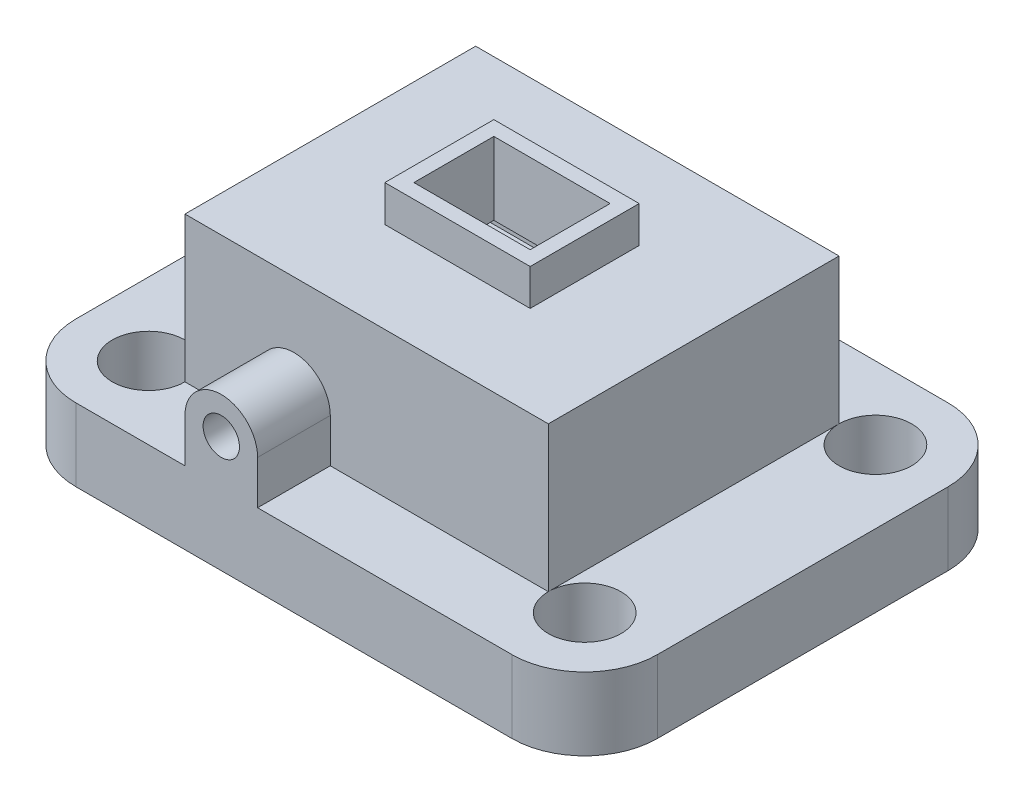
ISO-10303-21;
HEADER;
FILE_DESCRIPTION(('STEP AP214'),'2;1');
FILE_NAME('part.step','',(''),(''),'','','');
FILE_SCHEMA(('AUTOMOTIVE_DESIGN { 1 0 10303 214 1 1 1 1 }'));
ENDSEC;
DATA;
#1=APPLICATION_CONTEXT('core data for automotive mechanical design processes');
#2=APPLICATION_PROTOCOL_DEFINITION('international standard','automotive_design',2000,#1);
#3=PRODUCT_CONTEXT('',#1,'mechanical');
#4=PRODUCT('Part','Part','',(#3));
#5=PRODUCT_RELATED_PRODUCT_CATEGORY('part','',(#4));
#6=PRODUCT_DEFINITION_FORMATION('','',#4);
#7=PRODUCT_DEFINITION_CONTEXT('part definition',#1,'design');
#8=PRODUCT_DEFINITION('design','',#6,#7);
#9=PRODUCT_DEFINITION_SHAPE('','',#8);
#10=(LENGTH_UNIT() NAMED_UNIT(*) SI_UNIT(.MILLI.,.METRE.));
#11=(NAMED_UNIT(*) PLANE_ANGLE_UNIT() SI_UNIT($,.RADIAN.));
#12=(NAMED_UNIT(*) SI_UNIT($,.STERADIAN.) SOLID_ANGLE_UNIT());
#13=UNCERTAINTY_MEASURE_WITH_UNIT(LENGTH_MEASURE(1.E-05),#10,'distance_accuracy_value','');
#14=(GEOMETRIC_REPRESENTATION_CONTEXT(3) GLOBAL_UNCERTAINTY_ASSIGNED_CONTEXT((#13)) GLOBAL_UNIT_ASSIGNED_CONTEXT((#10,
#11,#12)) REPRESENTATION_CONTEXT('',''));
#15=CARTESIAN_POINT('',(0.,0.,0.));
#16=DIRECTION('',(0.,0.,1.));
#17=DIRECTION('',(1.,0.,0.));
#18=AXIS2_PLACEMENT_3D('',#15,#16,#17);
#19=CARTESIAN_POINT('',(0.,25.,45.));
#20=DIRECTION('',(0.,0.,-1.));
#21=DIRECTION('',(-1.,0.,0.));
#22=AXIS2_PLACEMENT_3D('',#19,#20,#21);
#23=PLANE('',#22);
#24=DIRECTION('',(1.,0.,0.));
#25=VECTOR('',#24,1.);
#26=CARTESIAN_POINT('',(0.,15.,45.));
#27=LINE('',#26,#25);
#28=CARTESIAN_POINT('',(32.2912878474779,15.,45.));
#29=VERTEX_POINT('',#28);
#30=CARTESIAN_POINT('',(60.,15.,45.));
#31=VERTEX_POINT('',#30);
#32=EDGE_CURVE('E483',#29,#31,#27,.T.);
#33=ORIENTED_EDGE('',*,*,#32,.F.);
#34=CARTESIAN_POINT('',(30.,16.,45.));
#35=DIRECTION('',(0.,0.,-1.));
#36=DIRECTION('',(-1.,0.,0.));
#37=AXIS2_PLACEMENT_3D('',#34,#35,#36);
#38=CIRCLE('',#37,2.50000000000001);
#39=CARTESIAN_POINT('',(27.7087121525221,15.,45.));
#40=VERTEX_POINT('',#39);
#41=EDGE_CURVE('E537',#29,#40,#38,.F.);
#42=ORIENTED_EDGE('',*,*,#41,.T.);
#43=CARTESIAN_POINT('',(20.,15.,45.));
#44=VERTEX_POINT('',#43);
#45=EDGE_CURVE('E479',#44,#40,#27,.T.);
#46=ORIENTED_EDGE('',*,*,#45,.F.);
#47=DIRECTION('',(0.,-1.,0.));
#48=VECTOR('',#47,1.);
#49=CARTESIAN_POINT('',(20.,25.,45.));
#50=LINE('',#49,#48);
#51=CARTESIAN_POINT('',(20.,25.,45.));
#52=VERTEX_POINT('',#51);
#53=EDGE_CURVE('E466',#52,#44,#50,.T.);
#54=ORIENTED_EDGE('',*,*,#53,.F.);
#55=DIRECTION('',(1.,0.,0.));
#56=VECTOR('',#55,1.);
#57=CARTESIAN_POINT('',(0.,25.,45.));
#58=LINE('',#57,#56);
#59=CARTESIAN_POINT('',(60.,25.,45.));
#60=VERTEX_POINT('',#59);
#61=EDGE_CURVE('E472',#52,#60,#58,.T.);
#62=ORIENTED_EDGE('',*,*,#61,.T.);
#63=DIRECTION('',(0.,-1.,0.));
#64=VECTOR('',#63,1.);
#65=CARTESIAN_POINT('',(60.,25.,45.));
#66=LINE('',#65,#64);
#67=EDGE_CURVE('E459',#60,#31,#66,.T.);
#68=ORIENTED_EDGE('',*,*,#67,.T.);
#69=EDGE_LOOP('',(#33,#42,#46,#54,#62,#68));
#70=FACE_BOUND('',#69,.T.);
#71=ADVANCED_FACE('F96',(#70),#23,.T.);
#72=CARTESIAN_POINT('',(60.,25.,0.));
#73=DIRECTION('',(1.,0.,0.));
#74=DIRECTION('',(0.,0.,-1.));
#75=AXIS2_PLACEMENT_3D('',#72,#73,#74);
#76=PLANE('',#75);
#77=DIRECTION('',(0.,0.,1.));
#78=VECTOR('',#77,1.);
#79=CARTESIAN_POINT('',(60.,15.,0.));
#80=LINE('',#79,#78);
#81=CARTESIAN_POINT('',(60.,15.,15.));
#82=VERTEX_POINT('',#81);
#83=EDGE_CURVE('E476',#82,#31,#80,.T.);
#84=ORIENTED_EDGE('',*,*,#83,.T.);
#85=ORIENTED_EDGE('',*,*,#67,.F.);
#86=DIRECTION('',(0.,0.,1.));
#87=VECTOR('',#86,1.);
#88=CARTESIAN_POINT('',(60.,25.,0.));
#89=LINE('',#88,#87);
#90=CARTESIAN_POINT('',(60.,25.,15.));
#91=VERTEX_POINT('',#90);
#92=EDGE_CURVE('E489',#91,#60,#89,.T.);
#93=ORIENTED_EDGE('',*,*,#92,.F.);
#94=DIRECTION('',(0.,-1.,0.));
#95=VECTOR('',#94,1.);
#96=CARTESIAN_POINT('',(60.,25.,15.));
#97=LINE('',#96,#95);
#98=EDGE_CURVE('E462',#91,#82,#97,.T.);
#99=ORIENTED_EDGE('',*,*,#98,.T.);
#100=EDGE_LOOP('',(#84,#85,#93,#99));
#101=FACE_BOUND('',#100,.T.);
#102=ADVANCED_FACE('F557',(#101),#76,.F.);
#103=CARTESIAN_POINT('',(0.,25.,15.));
#104=DIRECTION('',(0.,0.,-1.));
#105=DIRECTION('',(-1.,0.,0.));
#106=AXIS2_PLACEMENT_3D('',#103,#104,#105);
#107=PLANE('',#106);
#108=DIRECTION('',(1.,0.,0.));
#109=VECTOR('',#108,1.);
#110=CARTESIAN_POINT('',(0.,15.,15.));
#111=LINE('',#110,#109);
#112=CARTESIAN_POINT('',(20.,15.,15.));
#113=VERTEX_POINT('',#112);
#114=EDGE_CURVE('E473',#113,#82,#111,.T.);
#115=ORIENTED_EDGE('',*,*,#114,.T.);
#116=ORIENTED_EDGE('',*,*,#98,.F.);
#117=DIRECTION('',(1.,0.,0.));
#118=VECTOR('',#117,1.);
#119=CARTESIAN_POINT('',(0.,25.,15.));
#120=LINE('',#119,#118);
#121=CARTESIAN_POINT('',(20.,25.,15.));
#122=VERTEX_POINT('',#121);
#123=EDGE_CURVE('E486',#122,#91,#120,.T.);
#124=ORIENTED_EDGE('',*,*,#123,.F.);
#125=DIRECTION('',(0.,-1.,0.));
#126=VECTOR('',#125,1.);
#127=CARTESIAN_POINT('',(20.,25.,15.));
#128=LINE('',#127,#126);
#129=EDGE_CURVE('E464',#122,#113,#128,.T.);
#130=ORIENTED_EDGE('',*,*,#129,.T.);
#131=EDGE_LOOP('',(#115,#116,#124,#130));
#132=FACE_BOUND('',#131,.T.);
#133=ADVANCED_FACE('F559',(#132),#107,.F.);
#134=CARTESIAN_POINT('',(20.,25.,0.));
#135=DIRECTION('',(-1.,0.,0.));
#136=DIRECTION('',(0.,0.,1.));
#137=AXIS2_PLACEMENT_3D('',#134,#135,#136);
#138=PLANE('',#137);
#139=DIRECTION('',(0.,0.,-1.));
#140=VECTOR('',#139,1.);
#141=CARTESIAN_POINT('',(20.,15.,0.));
#142=LINE('',#141,#140);
#143=EDGE_CURVE('E469',#44,#113,#142,.T.);
#144=ORIENTED_EDGE('',*,*,#143,.T.);
#145=ORIENTED_EDGE('',*,*,#129,.F.);
#146=DIRECTION('',(0.,0.,-1.));
#147=VECTOR('',#146,1.);
#148=CARTESIAN_POINT('',(20.,25.,0.));
#149=LINE('',#148,#147);
#150=EDGE_CURVE('E468',#52,#122,#149,.T.);
#151=ORIENTED_EDGE('',*,*,#150,.F.);
#152=ORIENTED_EDGE('',*,*,#53,.T.);
#153=EDGE_LOOP('',(#144,#145,#151,#152));
#154=FACE_BOUND('',#153,.T.);
#155=ADVANCED_FACE('F550',(#154),#138,.F.);
#156=CARTESIAN_POINT('',(0.,25.,0.));
#157=DIRECTION('',(0.,-1.,0.));
#158=DIRECTION('',(0.,0.,-1.));
#159=AXIS2_PLACEMENT_3D('',#156,#157,#158);
#160=PLANE('',#159);
#161=DIRECTION('',(0.,0.,1.));
#162=VECTOR('',#161,1.);
#163=CARTESIAN_POINT('',(48.,25.,0.));
#164=LINE('',#163,#162);
#165=CARTESIAN_POINT('',(48.,25.,24.5));
#166=VERTEX_POINT('',#165);
#167=CARTESIAN_POINT('',(48.,25.,35.5));
#168=VERTEX_POINT('',#167);
#169=EDGE_CURVE('E12',#166,#168,#164,.T.);
#170=ORIENTED_EDGE('',*,*,#169,.F.);
#171=DIRECTION('',(1.,0.,0.));
#172=VECTOR('',#171,1.);
#173=CARTESIAN_POINT('',(0.,25.,24.5));
#174=LINE('',#173,#172);
#175=CARTESIAN_POINT('',(32.,25.,24.5));
#176=VERTEX_POINT('',#175);
#177=EDGE_CURVE('E298',#176,#166,#174,.T.);
#178=ORIENTED_EDGE('',*,*,#177,.F.);
#179=DIRECTION('',(0.,0.,-1.));
#180=VECTOR('',#179,1.);
#181=CARTESIAN_POINT('',(32.,25.,0.));
#182=LINE('',#181,#180);
#183=CARTESIAN_POINT('',(32.,25.,35.5));
#184=VERTEX_POINT('',#183);
#185=EDGE_CURVE('E302',#184,#176,#182,.T.);
#186=ORIENTED_EDGE('',*,*,#185,.F.);
#187=DIRECTION('',(-1.,0.,0.));
#188=VECTOR('',#187,1.);
#189=CARTESIAN_POINT('',(0.,25.,35.5));
#190=LINE('',#189,#188);
#191=EDGE_CURVE('E104',#168,#184,#190,.T.);
#192=ORIENTED_EDGE('',*,*,#191,.F.);
#193=EDGE_LOOP('',(#170,#178,#186,#192));
#194=FACE_BOUND('',#193,.T.);
#195=ORIENTED_EDGE('',*,*,#61,.F.);
#196=ORIENTED_EDGE('',*,*,#150,.T.);
#197=ORIENTED_EDGE('',*,*,#123,.T.);
#198=ORIENTED_EDGE('',*,*,#92,.T.);
#199=EDGE_LOOP('',(#195,#196,#197,#198));
#200=FACE_BOUND('',#199,.T.);
#201=ADVANCED_FACE('F305',(#194,#200),#160,.T.);
#202=CARTESIAN_POINT('',(0.,15.,0.));
#203=DIRECTION('',(0.,-1.,0.));
#204=DIRECTION('',(0.,0.,-1.));
#205=AXIS2_PLACEMENT_3D('',#202,#203,#204);
#206=PLANE('',#205);
#207=ORIENTED_EDGE('',*,*,#45,.T.);
#208=EDGE_CURVE('E482',#40,#29,#27,.T.);
#209=ORIENTED_EDGE('',*,*,#208,.T.);
#210=ORIENTED_EDGE('',*,*,#32,.T.);
#211=ORIENTED_EDGE('',*,*,#83,.F.);
#212=ORIENTED_EDGE('',*,*,#114,.F.);
#213=ORIENTED_EDGE('',*,*,#143,.F.);
#214=EDGE_LOOP('',(#207,#209,#210,#211,#212,#213));
#215=FACE_BOUND('',#214,.T.);
#216=ADVANCED_FACE('F546',(#215),#206,.F.);
#217=CARTESIAN_POINT('',(0.,25.,45.));
#218=DIRECTION('',(0.,0.,-1.));
#219=DIRECTION('',(-1.,0.,0.));
#220=AXIS2_PLACEMENT_3D('',#217,#218,#219);
#221=PLANE('',#220);
#222=EDGE_CURVE('E118',#40,#29,#38,.F.);
#223=ORIENTED_EDGE('',*,*,#222,.T.);
#224=ORIENTED_EDGE('',*,*,#208,.F.);
#225=EDGE_LOOP('',(#223,#224));
#226=FACE_BOUND('',#225,.T.);
#227=ADVANCED_FACE('F579',(#226),#221,.F.);
#228=CARTESIAN_POINT('',(0.,30.,0.));
#229=DIRECTION('',(0.,-1.,0.));
#230=DIRECTION('',(0.,0.,-1.));
#231=AXIS2_PLACEMENT_3D('',#228,#229,#230);
#232=PLANE('',#231);
#233=DIRECTION('',(1.,0.,0.));
#234=VECTOR('',#233,1.);
#235=CARTESIAN_POINT('',(0.,30.,50.));
#236=LINE('',#235,#234);
#237=CARTESIAN_POINT('',(15.,30.,50.));
#238=VERTEX_POINT('',#237);
#239=CARTESIAN_POINT('',(65.,30.,50.));
#240=VERTEX_POINT('',#239);
#241=EDGE_CURVE('E440',#238,#240,#236,.T.);
#242=ORIENTED_EDGE('',*,*,#241,.T.);
#243=DIRECTION('',(0.,0.,1.));
#244=VECTOR('',#243,1.);
#245=CARTESIAN_POINT('',(65.,30.,0.));
#246=LINE('',#245,#244);
#247=CARTESIAN_POINT('',(65.,30.,9.99999999999999));
#248=VERTEX_POINT('',#247);
#249=EDGE_CURVE('E455',#248,#240,#246,.T.);
#250=ORIENTED_EDGE('',*,*,#249,.F.);
#251=DIRECTION('',(1.,0.,0.));
#252=VECTOR('',#251,1.);
#253=CARTESIAN_POINT('',(0.,30.,9.99999999999999));
#254=LINE('',#253,#252);
#255=CARTESIAN_POINT('',(15.,30.,9.99999999999999));
#256=VERTEX_POINT('',#255);
#257=EDGE_CURVE('E452',#256,#248,#254,.T.);
#258=ORIENTED_EDGE('',*,*,#257,.F.);
#259=DIRECTION('',(0.,0.,-1.));
#260=VECTOR('',#259,1.);
#261=CARTESIAN_POINT('',(15.,30.,0.));
#262=LINE('',#261,#260);
#263=EDGE_CURVE('E436',#238,#256,#262,.T.);
#264=ORIENTED_EDGE('',*,*,#263,.F.);
#265=EDGE_LOOP('',(#242,#250,#258,#264));
#266=FACE_BOUND('',#265,.T.);
#267=DIRECTION('',(0.,0.,1.));
#268=VECTOR('',#267,1.);
#269=CARTESIAN_POINT('',(30.,30.,22.5));
#270=LINE('',#269,#268);
#271=CARTESIAN_POINT('',(30.,30.,22.5));
#272=VERTEX_POINT('',#271);
#273=CARTESIAN_POINT('',(30.,30.,37.5));
#274=VERTEX_POINT('',#273);
#275=EDGE_CURVE('E516',#272,#274,#270,.T.);
#276=ORIENTED_EDGE('',*,*,#275,.F.);
#277=DIRECTION('',(-1.,0.,0.));
#278=VECTOR('',#277,1.);
#279=CARTESIAN_POINT('',(30.,30.,22.5));
#280=LINE('',#279,#278);
#281=CARTESIAN_POINT('',(50.,30.,22.5));
#282=VERTEX_POINT('',#281);
#283=EDGE_CURVE('E506',#282,#272,#280,.T.);
#284=ORIENTED_EDGE('',*,*,#283,.F.);
#285=DIRECTION('',(0.,0.,-1.));
#286=VECTOR('',#285,1.);
#287=CARTESIAN_POINT('',(50.,30.,22.5));
#288=LINE('',#287,#286);
#289=CARTESIAN_POINT('',(50.,30.,37.5));
#290=VERTEX_POINT('',#289);
#291=EDGE_CURVE('E510',#290,#282,#288,.T.);
#292=ORIENTED_EDGE('',*,*,#291,.F.);
#293=DIRECTION('',(1.,0.,0.));
#294=VECTOR('',#293,1.);
#295=CARTESIAN_POINT('',(40.,30.,37.5));
#296=LINE('',#295,#294);
#297=EDGE_CURVE('E513',#274,#290,#296,.T.);
#298=ORIENTED_EDGE('',*,*,#297,.F.);
#299=EDGE_LOOP('',(#276,#284,#292,#298));
#300=FACE_BOUND('',#299,.T.);
#301=ADVANCED_FACE('F575',(#266,#300),#232,.F.);
#302=CARTESIAN_POINT('',(0.,10.,0.));
#303=DIRECTION('',(0.,1.,0.));
#304=DIRECTION('',(0.,0.,1.));
#305=AXIS2_PLACEMENT_3D('',#302,#303,#304);
#306=PLANE('',#305);
#307=CARTESIAN_POINT('',(70.,10.,50.));
#308=DIRECTION('',(0.,1.,0.));
#309=DIRECTION('',(0.,0.,1.));
#310=AXIS2_PLACEMENT_3D('',#307,#308,#309);
#311=CIRCLE('',#310,5.00000000000001);
#312=CARTESIAN_POINT('',(65.,10.,50.));
#313=VERTEX_POINT('',#312);
#314=EDGE_CURVE('E372',#313,#313,#311,.F.);
#315=ORIENTED_EDGE('',*,*,#314,.T.);
#316=DIRECTION('',(1.,0.,0.));
#317=VECTOR('',#316,1.);
#318=CARTESIAN_POINT('',(0.,10.,50.));
#319=LINE('',#318,#317);
#320=CARTESIAN_POINT('',(35.,10.,50.));
#321=VERTEX_POINT('',#320);
#322=EDGE_CURVE('E449',#321,#313,#319,.T.);
#323=ORIENTED_EDGE('',*,*,#322,.F.);
#324=DIRECTION('',(0.,0.,1.));
#325=VECTOR('',#324,1.);
#326=CARTESIAN_POINT('',(35.,10.,50.));
#327=LINE('',#326,#325);
#328=CARTESIAN_POINT('',(35.,10.,60.));
#329=VERTEX_POINT('',#328);
#330=EDGE_CURVE('E366',#321,#329,#327,.T.);
#331=ORIENTED_EDGE('',*,*,#330,.T.);
#332=DIRECTION('',(1.,0.,0.));
#333=VECTOR('',#332,1.);
#334=CARTESIAN_POINT('',(0.,10.,60.));
#335=LINE('',#334,#333);
#336=CARTESIAN_POINT('',(70.,10.,60.));
#337=VERTEX_POINT('',#336);
#338=EDGE_CURVE('E393',#329,#337,#335,.T.);
#339=ORIENTED_EDGE('',*,*,#338,.T.);
#340=CARTESIAN_POINT('',(70.,10.,50.));
#341=DIRECTION('',(0.,1.,0.));
#342=DIRECTION('',(0.,0.,1.));
#343=AXIS2_PLACEMENT_3D('',#340,#341,#342);
#344=CIRCLE('',#343,10.);
#345=CARTESIAN_POINT('',(80.,10.,50.));
#346=VERTEX_POINT('',#345);
#347=EDGE_CURVE('E388',#337,#346,#344,.T.);
#348=ORIENTED_EDGE('',*,*,#347,.T.);
#349=DIRECTION('',(0.,0.,1.));
#350=VECTOR('',#349,1.);
#351=CARTESIAN_POINT('',(80.,10.,0.));
#352=LINE('',#351,#350);
#353=CARTESIAN_POINT('',(80.,10.,9.99999999999999));
#354=VERTEX_POINT('',#353);
#355=EDGE_CURVE('E385',#354,#346,#352,.T.);
#356=ORIENTED_EDGE('',*,*,#355,.F.);
#357=CARTESIAN_POINT('',(70.,10.,9.99999999999999));
#358=DIRECTION('',(0.,1.,0.));
#359=DIRECTION('',(0.,0.,1.));
#360=AXIS2_PLACEMENT_3D('',#357,#358,#359);
#361=CIRCLE('',#360,10.);
#362=CARTESIAN_POINT('',(70.,10.,0.));
#363=VERTEX_POINT('',#362);
#364=EDGE_CURVE('E383',#354,#363,#361,.T.);
#365=ORIENTED_EDGE('',*,*,#364,.T.);
#366=DIRECTION('',(1.,0.,0.));
#367=VECTOR('',#366,1.);
#368=CARTESIAN_POINT('',(0.,10.,0.));
#369=LINE('',#368,#367);
#370=CARTESIAN_POINT('',(10.,10.,0.));
#371=VERTEX_POINT('',#370);
#372=EDGE_CURVE('E380',#371,#363,#369,.T.);
#373=ORIENTED_EDGE('',*,*,#372,.F.);
#374=CARTESIAN_POINT('',(10.,10.,9.99999999999999));
#375=DIRECTION('',(0.,1.,0.));
#376=DIRECTION('',(0.,0.,1.));
#377=AXIS2_PLACEMENT_3D('',#374,#375,#376);
#378=CIRCLE('',#377,9.99999999999999);
#379=CARTESIAN_POINT('',(0.,10.,9.99999999999999));
#380=VERTEX_POINT('',#379);
#381=EDGE_CURVE('E378',#371,#380,#378,.T.);
#382=ORIENTED_EDGE('',*,*,#381,.T.);
#383=DIRECTION('',(0.,0.,1.));
#384=VECTOR('',#383,1.);
#385=CARTESIAN_POINT('',(0.,10.,0.));
#386=LINE('',#385,#384);
#387=CARTESIAN_POINT('',(0.,10.,50.));
#388=VERTEX_POINT('',#387);
#389=EDGE_CURVE('E335',#380,#388,#386,.T.);
#390=ORIENTED_EDGE('',*,*,#389,.T.);
#391=CARTESIAN_POINT('',(10.,10.,50.));
#392=DIRECTION('',(0.,1.,0.));
#393=DIRECTION('',(0.,0.,1.));
#394=AXIS2_PLACEMENT_3D('',#391,#392,#393);
#395=CIRCLE('',#394,10.);
#396=CARTESIAN_POINT('',(10.,10.,60.));
#397=VERTEX_POINT('',#396);
#398=EDGE_CURVE('E394',#388,#397,#395,.T.);
#399=ORIENTED_EDGE('',*,*,#398,.T.);
#400=CARTESIAN_POINT('',(25.,10.,60.));
#401=VERTEX_POINT('',#400);
#402=EDGE_CURVE('E390',#397,#401,#335,.T.);
#403=ORIENTED_EDGE('',*,*,#402,.T.);
#404=DIRECTION('',(0.,0.,1.));
#405=VECTOR('',#404,1.);
#406=CARTESIAN_POINT('',(25.,10.,50.));
#407=LINE('',#406,#405);
#408=CARTESIAN_POINT('',(25.,10.,50.));
#409=VERTEX_POINT('',#408);
#410=EDGE_CURVE('E403',#409,#401,#407,.T.);
#411=ORIENTED_EDGE('',*,*,#410,.F.);
#412=CARTESIAN_POINT('',(15.,10.,50.));
#413=VERTEX_POINT('',#412);
#414=EDGE_CURVE('E447',#413,#409,#319,.T.);
#415=ORIENTED_EDGE('',*,*,#414,.F.);
#416=CARTESIAN_POINT('',(10.,10.,50.));
#417=DIRECTION('',(0.,1.,0.));
#418=DIRECTION('',(0.,0.,1.));
#419=AXIS2_PLACEMENT_3D('',#416,#417,#418);
#420=CIRCLE('',#419,5.);
#421=EDGE_CURVE('E331',#413,#413,#420,.T.);
#422=ORIENTED_EDGE('',*,*,#421,.F.);
#423=DIRECTION('',(0.,0.,-1.));
#424=VECTOR('',#423,1.);
#425=CARTESIAN_POINT('',(15.,10.,0.));
#426=LINE('',#425,#424);
#427=CARTESIAN_POINT('',(15.,10.,9.99999999999999));
#428=VERTEX_POINT('',#427);
#429=EDGE_CURVE('E437',#413,#428,#426,.T.);
#430=ORIENTED_EDGE('',*,*,#429,.T.);
#431=CARTESIAN_POINT('',(10.,10.,9.99999999999999));
#432=DIRECTION('',(0.,1.,0.));
#433=DIRECTION('',(0.,0.,1.));
#434=AXIS2_PLACEMENT_3D('',#431,#432,#433);
#435=CIRCLE('',#434,5.);
#436=EDGE_CURVE('E369',#428,#428,#435,.T.);
#437=ORIENTED_EDGE('',*,*,#436,.F.);
#438=DIRECTION('',(1.,0.,0.));
#439=VECTOR('',#438,1.);
#440=CARTESIAN_POINT('',(0.,10.,9.99999999999999));
#441=LINE('',#440,#439);
#442=CARTESIAN_POINT('',(65.,10.,9.99999999999999));
#443=VERTEX_POINT('',#442);
#444=EDGE_CURVE('E441',#428,#443,#441,.T.);
#445=ORIENTED_EDGE('',*,*,#444,.T.);
#446=CARTESIAN_POINT('',(70.,10.,9.99999999999999));
#447=DIRECTION('',(0.,1.,0.));
#448=DIRECTION('',(0.,0.,1.));
#449=AXIS2_PLACEMENT_3D('',#446,#447,#448);
#450=CIRCLE('',#449,5.);
#451=EDGE_CURVE('E375',#443,#443,#450,.F.);
#452=ORIENTED_EDGE('',*,*,#451,.T.);
#453=DIRECTION('',(0.,0.,1.));
#454=VECTOR('',#453,1.);
#455=CARTESIAN_POINT('',(65.,10.,0.));
#456=LINE('',#455,#454);
#457=EDGE_CURVE('E444',#443,#313,#456,.T.);
#458=ORIENTED_EDGE('',*,*,#457,.T.);
#459=EDGE_LOOP('',(#315,#323,#331,#339,#348,#356,#365,#373,#382,#390,#399,#403,#411,#415,#422,
#430,#437,#445,#452,#458));
#460=FACE_BOUND('',#459,.T.);
#461=ADVANCED_FACE('F578',(#460),#306,.T.);
#462=CARTESIAN_POINT('',(0.,10.,0.));
#463=DIRECTION('',(1.,0.,0.));
#464=DIRECTION('',(0.,0.,-1.));
#465=AXIS2_PLACEMENT_3D('',#462,#463,#464);
#466=PLANE('',#465);
#467=DIRECTION('',(0.,0.,1.));
#468=VECTOR('',#467,1.);
#469=CARTESIAN_POINT('',(0.,0.,0.));
#470=LINE('',#469,#468);
#471=CARTESIAN_POINT('',(0.,0.,9.99999999999999));
#472=VERTEX_POINT('',#471);
#473=CARTESIAN_POINT('',(0.,0.,50.));
#474=VERTEX_POINT('',#473);
#475=EDGE_CURVE('E363',#472,#474,#470,.T.);
#476=ORIENTED_EDGE('',*,*,#475,.T.);
#477=DIRECTION('',(0.,-1.,0.));
#478=VECTOR('',#477,1.);
#479=CARTESIAN_POINT('',(0.,10.,50.));
#480=LINE('',#479,#478);
#481=EDGE_CURVE('E303',#388,#474,#480,.T.);
#482=ORIENTED_EDGE('',*,*,#481,.F.);
#483=ORIENTED_EDGE('',*,*,#389,.F.);
#484=DIRECTION('',(0.,-1.,0.));
#485=VECTOR('',#484,1.);
#486=CARTESIAN_POINT('',(0.,10.,9.99999999999999));
#487=LINE('',#486,#485);
#488=EDGE_CURVE('E328',#380,#472,#487,.T.);
#489=ORIENTED_EDGE('',*,*,#488,.T.);
#490=EDGE_LOOP('',(#476,#482,#483,#489));
#491=FACE_BOUND('',#490,.T.);
#492=ADVANCED_FACE('F98',(#491),#466,.F.);
#493=CARTESIAN_POINT('',(10.,10.,50.));
#494=DIRECTION('',(0.,-1.,0.));
#495=DIRECTION('',(0.,0.,-1.));
#496=AXIS2_PLACEMENT_3D('',#493,#494,#495);
#497=CYLINDRICAL_SURFACE('',#496,10.);
#498=CARTESIAN_POINT('',(10.,0.,50.));
#499=DIRECTION('',(0.,1.,0.));
#500=DIRECTION('',(0.,0.,1.));
#501=AXIS2_PLACEMENT_3D('',#498,#499,#500);
#502=CIRCLE('',#501,10.);
#503=CARTESIAN_POINT('',(10.,0.,60.));
#504=VERTEX_POINT('',#503);
#505=EDGE_CURVE('E361',#474,#504,#502,.T.);
#506=ORIENTED_EDGE('',*,*,#505,.T.);
#507=DIRECTION('',(0.,-1.,0.));
#508=VECTOR('',#507,1.);
#509=CARTESIAN_POINT('',(10.,10.,60.));
#510=LINE('',#509,#508);
#511=EDGE_CURVE('E314',#397,#504,#510,.T.);
#512=ORIENTED_EDGE('',*,*,#511,.F.);
#513=ORIENTED_EDGE('',*,*,#398,.F.);
#514=ORIENTED_EDGE('',*,*,#481,.T.);
#515=EDGE_LOOP('',(#506,#512,#513,#514));
#516=FACE_BOUND('',#515,.T.);
#517=ADVANCED_FACE('F659',(#516),#497,.T.);
#518=CARTESIAN_POINT('',(0.,10.,60.));
#519=DIRECTION('',(0.,0.,-1.));
#520=DIRECTION('',(-1.,0.,0.));
#521=AXIS2_PLACEMENT_3D('',#518,#519,#520);
#522=PLANE('',#521);
#523=DIRECTION('',(1.,0.,0.));
#524=VECTOR('',#523,1.);
#525=CARTESIAN_POINT('',(0.,0.,60.));
#526=LINE('',#525,#524);
#527=CARTESIAN_POINT('',(70.,0.,60.));
#528=VERTEX_POINT('',#527);
#529=EDGE_CURVE('E359',#504,#528,#526,.T.);
#530=ORIENTED_EDGE('',*,*,#529,.T.);
#531=DIRECTION('',(0.,-1.,0.));
#532=VECTOR('',#531,1.);
#533=CARTESIAN_POINT('',(70.,10.,60.));
#534=LINE('',#533,#532);
#535=EDGE_CURVE('E317',#337,#528,#534,.T.);
#536=ORIENTED_EDGE('',*,*,#535,.F.);
#537=ORIENTED_EDGE('',*,*,#338,.F.);
#538=DIRECTION('',(0.,1.,0.));
#539=VECTOR('',#538,1.);
#540=CARTESIAN_POINT('',(35.,10.,60.));
#541=LINE('',#540,#539);
#542=CARTESIAN_POINT('',(35.,16.,60.));
#543=VERTEX_POINT('',#542);
#544=EDGE_CURVE('E414',#329,#543,#541,.T.);
#545=ORIENTED_EDGE('',*,*,#544,.T.);
#546=CARTESIAN_POINT('',(30.,16.,60.));
#547=DIRECTION('',(0.,0.,1.));
#548=DIRECTION('',(1.,0.,0.));
#549=AXIS2_PLACEMENT_3D('',#546,#547,#548);
#550=CIRCLE('',#549,4.99999999999999);
#551=CARTESIAN_POINT('',(25.,16.,60.));
#552=VERTEX_POINT('',#551);
#553=EDGE_CURVE('E411',#543,#552,#550,.T.);
#554=ORIENTED_EDGE('',*,*,#553,.T.);
#555=DIRECTION('',(0.,-1.,0.));
#556=VECTOR('',#555,1.);
#557=CARTESIAN_POINT('',(25.,16.,60.));
#558=LINE('',#557,#556);
#559=EDGE_CURVE('E407',#552,#401,#558,.T.);
#560=ORIENTED_EDGE('',*,*,#559,.T.);
#561=ORIENTED_EDGE('',*,*,#402,.F.);
#562=ORIENTED_EDGE('',*,*,#511,.T.);
#563=EDGE_LOOP('',(#530,#536,#537,#545,#554,#560,#561,#562));
#564=FACE_BOUND('',#563,.T.);
#565=CARTESIAN_POINT('',(30.,16.,60.));
#566=DIRECTION('',(0.,0.,1.));
#567=DIRECTION('',(1.,0.,0.));
#568=AXIS2_PLACEMENT_3D('',#565,#566,#567);
#569=CIRCLE('',#568,2.50000000000001);
#570=CARTESIAN_POINT('',(32.5,16.,60.));
#571=VERTEX_POINT('',#570);
#572=EDGE_CURVE('E417',#571,#571,#569,.T.);
#573=ORIENTED_EDGE('',*,*,#572,.F.);
#574=EDGE_LOOP('',(#573));
#575=FACE_BOUND('',#574,.T.);
#576=ADVANCED_FACE('F656',(#564,#575),#522,.F.);
#577=CARTESIAN_POINT('',(70.,10.,50.));
#578=DIRECTION('',(0.,-1.,0.));
#579=DIRECTION('',(0.,0.,-1.));
#580=AXIS2_PLACEMENT_3D('',#577,#578,#579);
#581=CYLINDRICAL_SURFACE('',#580,10.);
#582=CARTESIAN_POINT('',(70.,0.,50.));
#583=DIRECTION('',(0.,1.,0.));
#584=DIRECTION('',(0.,0.,1.));
#585=AXIS2_PLACEMENT_3D('',#582,#583,#584);
#586=CIRCLE('',#585,10.);
#587=CARTESIAN_POINT('',(80.,0.,50.));
#588=VERTEX_POINT('',#587);
#589=EDGE_CURVE('E356',#528,#588,#586,.T.);
#590=ORIENTED_EDGE('',*,*,#589,.T.);
#591=DIRECTION('',(0.,-1.,0.));
#592=VECTOR('',#591,1.);
#593=CARTESIAN_POINT('',(80.,10.,50.));
#594=LINE('',#593,#592);
#595=EDGE_CURVE('E320',#346,#588,#594,.T.);
#596=ORIENTED_EDGE('',*,*,#595,.F.);
#597=ORIENTED_EDGE('',*,*,#347,.F.);
#598=ORIENTED_EDGE('',*,*,#535,.T.);
#599=EDGE_LOOP('',(#590,#596,#597,#598));
#600=FACE_BOUND('',#599,.T.);
#601=ADVANCED_FACE('F652',(#600),#581,.T.);
#602=CARTESIAN_POINT('',(80.,10.,0.));
#603=DIRECTION('',(1.,0.,0.));
#604=DIRECTION('',(0.,0.,-1.));
#605=AXIS2_PLACEMENT_3D('',#602,#603,#604);
#606=PLANE('',#605);
#607=DIRECTION('',(0.,0.,1.));
#608=VECTOR('',#607,1.);
#609=CARTESIAN_POINT('',(80.,0.,0.));
#610=LINE('',#609,#608);
#611=CARTESIAN_POINT('',(80.,0.,9.99999999999999));
#612=VERTEX_POINT('',#611);
#613=EDGE_CURVE('E353',#612,#588,#610,.T.);
#614=ORIENTED_EDGE('',*,*,#613,.F.);
#615=DIRECTION('',(0.,-1.,0.));
#616=VECTOR('',#615,1.);
#617=CARTESIAN_POINT('',(80.,10.,9.99999999999999));
#618=LINE('',#617,#616);
#619=EDGE_CURVE('E322',#354,#612,#618,.T.);
#620=ORIENTED_EDGE('',*,*,#619,.F.);
#621=ORIENTED_EDGE('',*,*,#355,.T.);
#622=ORIENTED_EDGE('',*,*,#595,.T.);
#623=EDGE_LOOP('',(#614,#620,#621,#622));
#624=FACE_BOUND('',#623,.T.);
#625=ADVANCED_FACE('F648',(#624),#606,.T.);
#626=CARTESIAN_POINT('',(70.,10.,9.99999999999999));
#627=DIRECTION('',(0.,-1.,0.));
#628=DIRECTION('',(0.,0.,-1.));
#629=AXIS2_PLACEMENT_3D('',#626,#627,#628);
#630=CYLINDRICAL_SURFACE('',#629,10.);
#631=CARTESIAN_POINT('',(70.,0.,9.99999999999999));
#632=DIRECTION('',(0.,1.,0.));
#633=DIRECTION('',(0.,0.,1.));
#634=AXIS2_PLACEMENT_3D('',#631,#632,#633);
#635=CIRCLE('',#634,10.);
#636=CARTESIAN_POINT('',(70.,0.,0.));
#637=VERTEX_POINT('',#636);
#638=EDGE_CURVE('E350',#612,#637,#635,.T.);
#639=ORIENTED_EDGE('',*,*,#638,.T.);
#640=DIRECTION('',(0.,-1.,0.));
#641=VECTOR('',#640,1.);
#642=CARTESIAN_POINT('',(70.,10.,0.));
#643=LINE('',#642,#641);
#644=EDGE_CURVE('E324',#363,#637,#643,.T.);
#645=ORIENTED_EDGE('',*,*,#644,.F.);
#646=ORIENTED_EDGE('',*,*,#364,.F.);
#647=ORIENTED_EDGE('',*,*,#619,.T.);
#648=EDGE_LOOP('',(#639,#645,#646,#647));
#649=FACE_BOUND('',#648,.T.);
#650=ADVANCED_FACE('F644',(#649),#630,.T.);
#651=CARTESIAN_POINT('',(0.,10.,0.));
#652=DIRECTION('',(0.,0.,-1.));
#653=DIRECTION('',(-1.,0.,0.));
#654=AXIS2_PLACEMENT_3D('',#651,#652,#653);
#655=PLANE('',#654);
#656=DIRECTION('',(1.,0.,0.));
#657=VECTOR('',#656,1.);
#658=CARTESIAN_POINT('',(0.,0.,0.));
#659=LINE('',#658,#657);
#660=CARTESIAN_POINT('',(10.,0.,0.));
#661=VERTEX_POINT('',#660);
#662=EDGE_CURVE('E347',#661,#637,#659,.T.);
#663=ORIENTED_EDGE('',*,*,#662,.F.);
#664=DIRECTION('',(0.,-1.,0.));
#665=VECTOR('',#664,1.);
#666=CARTESIAN_POINT('',(10.,10.,0.));
#667=LINE('',#666,#665);
#668=EDGE_CURVE('E326',#371,#661,#667,.T.);
#669=ORIENTED_EDGE('',*,*,#668,.F.);
#670=ORIENTED_EDGE('',*,*,#372,.T.);
#671=ORIENTED_EDGE('',*,*,#644,.T.);
#672=EDGE_LOOP('',(#663,#669,#670,#671));
#673=FACE_BOUND('',#672,.T.);
#674=ADVANCED_FACE('F630',(#673),#655,.T.);
#675=CARTESIAN_POINT('',(10.,10.,9.99999999999999));
#676=DIRECTION('',(0.,-1.,0.));
#677=DIRECTION('',(0.,0.,-1.));
#678=AXIS2_PLACEMENT_3D('',#675,#676,#677);
#679=CYLINDRICAL_SURFACE('',#678,5.);
#680=ORIENTED_EDGE('',*,*,#436,.T.);
#681=EDGE_LOOP('',(#680));
#682=FACE_BOUND('',#681,.T.);
#683=CARTESIAN_POINT('',(10.,0.,9.99999999999999));
#684=DIRECTION('',(0.,1.,0.));
#685=DIRECTION('',(0.,0.,1.));
#686=AXIS2_PLACEMENT_3D('',#683,#684,#685);
#687=CIRCLE('',#686,5.);
#688=CARTESIAN_POINT('',(10.,0.,15.));
#689=VERTEX_POINT('',#688);
#690=EDGE_CURVE('E336',#689,#689,#687,.T.);
#691=ORIENTED_EDGE('',*,*,#690,.F.);
#692=EDGE_LOOP('',(#691));
#693=FACE_BOUND('',#692,.T.);
#694=ADVANCED_FACE('F626',(#682,#693),#679,.F.);
#695=CARTESIAN_POINT('',(70.,10.,50.));
#696=DIRECTION('',(0.,-1.,0.));
#697=DIRECTION('',(0.,0.,-1.));
#698=AXIS2_PLACEMENT_3D('',#695,#696,#697);
#699=CYLINDRICAL_SURFACE('',#698,5.00000000000001);
#700=ORIENTED_EDGE('',*,*,#314,.F.);
#701=EDGE_LOOP('',(#700));
#702=FACE_BOUND('',#701,.T.);
#703=CARTESIAN_POINT('',(70.,0.,50.));
#704=DIRECTION('',(0.,1.,0.));
#705=DIRECTION('',(0.,0.,1.));
#706=AXIS2_PLACEMENT_3D('',#703,#704,#705);
#707=CIRCLE('',#706,5.00000000000001);
#708=CARTESIAN_POINT('',(70.,0.,55.));
#709=VERTEX_POINT('',#708);
#710=EDGE_CURVE('E339',#709,#709,#707,.F.);
#711=ORIENTED_EDGE('',*,*,#710,.T.);
#712=EDGE_LOOP('',(#711));
#713=FACE_BOUND('',#712,.T.);
#714=ADVANCED_FACE('F629',(#702,#713),#699,.F.);
#715=CARTESIAN_POINT('',(70.,10.,9.99999999999999));
#716=DIRECTION('',(0.,-1.,0.));
#717=DIRECTION('',(0.,0.,-1.));
#718=AXIS2_PLACEMENT_3D('',#715,#716,#717);
#719=CYLINDRICAL_SURFACE('',#718,5.);
#720=ORIENTED_EDGE('',*,*,#451,.F.);
#721=EDGE_LOOP('',(#720));
#722=FACE_BOUND('',#721,.T.);
#723=CARTESIAN_POINT('',(70.,0.,9.99999999999999));
#724=DIRECTION('',(0.,1.,0.));
#725=DIRECTION('',(0.,0.,1.));
#726=AXIS2_PLACEMENT_3D('',#723,#724,#725);
#727=CIRCLE('',#726,5.);
#728=CARTESIAN_POINT('',(70.,0.,15.));
#729=VERTEX_POINT('',#728);
#730=EDGE_CURVE('E342',#729,#729,#727,.F.);
#731=ORIENTED_EDGE('',*,*,#730,.T.);
#732=EDGE_LOOP('',(#731));
#733=FACE_BOUND('',#732,.T.);
#734=ADVANCED_FACE('F634',(#722,#733),#719,.F.);
#735=CARTESIAN_POINT('',(10.,10.,9.99999999999999));
#736=DIRECTION('',(0.,-1.,0.));
#737=DIRECTION('',(0.,0.,-1.));
#738=AXIS2_PLACEMENT_3D('',#735,#736,#737);
#739=CYLINDRICAL_SURFACE('',#738,9.99999999999999);
#740=CARTESIAN_POINT('',(10.,0.,9.99999999999999));
#741=DIRECTION('',(0.,1.,0.));
#742=DIRECTION('',(0.,0.,1.));
#743=AXIS2_PLACEMENT_3D('',#740,#741,#742);
#744=CIRCLE('',#743,9.99999999999999);
#745=EDGE_CURVE('E345',#661,#472,#744,.T.);
#746=ORIENTED_EDGE('',*,*,#745,.T.);
#747=ORIENTED_EDGE('',*,*,#488,.F.);
#748=ORIENTED_EDGE('',*,*,#381,.F.);
#749=ORIENTED_EDGE('',*,*,#668,.T.);
#750=EDGE_LOOP('',(#746,#747,#748,#749));
#751=FACE_BOUND('',#750,.T.);
#752=ADVANCED_FACE('F624',(#751),#739,.T.);
#753=CARTESIAN_POINT('',(10.,10.,50.));
#754=DIRECTION('',(0.,-1.,0.));
#755=DIRECTION('',(0.,0.,-1.));
#756=AXIS2_PLACEMENT_3D('',#753,#754,#755);
#757=CYLINDRICAL_SURFACE('',#756,5.);
#758=ORIENTED_EDGE('',*,*,#421,.T.);
#759=EDGE_LOOP('',(#758));
#760=FACE_BOUND('',#759,.T.);
#761=CARTESIAN_POINT('',(10.,0.,50.));
#762=DIRECTION('',(0.,1.,0.));
#763=DIRECTION('',(0.,0.,1.));
#764=AXIS2_PLACEMENT_3D('',#761,#762,#763);
#765=CIRCLE('',#764,5.);
#766=CARTESIAN_POINT('',(10.,0.,55.));
#767=VERTEX_POINT('',#766);
#768=EDGE_CURVE('E332',#767,#767,#765,.T.);
#769=ORIENTED_EDGE('',*,*,#768,.F.);
#770=EDGE_LOOP('',(#769));
#771=FACE_BOUND('',#770,.T.);
#772=ADVANCED_FACE('F620',(#760,#771),#757,.F.);
#773=CARTESIAN_POINT('',(0.,0.,0.));
#774=DIRECTION('',(0.,1.,0.));
#775=DIRECTION('',(0.,0.,1.));
#776=AXIS2_PLACEMENT_3D('',#773,#774,#775);
#777=PLANE('',#776);
#778=ORIENTED_EDGE('',*,*,#475,.F.);
#779=ORIENTED_EDGE('',*,*,#745,.F.);
#780=ORIENTED_EDGE('',*,*,#662,.T.);
#781=ORIENTED_EDGE('',*,*,#638,.F.);
#782=ORIENTED_EDGE('',*,*,#613,.T.);
#783=ORIENTED_EDGE('',*,*,#589,.F.);
#784=ORIENTED_EDGE('',*,*,#529,.F.);
#785=ORIENTED_EDGE('',*,*,#505,.F.);
#786=EDGE_LOOP('',(#778,#779,#780,#781,#782,#783,#784,#785));
#787=FACE_BOUND('',#786,.T.);
#788=ORIENTED_EDGE('',*,*,#730,.F.);
#789=EDGE_LOOP('',(#788));
#790=FACE_BOUND('',#789,.T.);
#791=ORIENTED_EDGE('',*,*,#710,.F.);
#792=EDGE_LOOP('',(#791));
#793=FACE_BOUND('',#792,.T.);
#794=ORIENTED_EDGE('',*,*,#690,.T.);
#795=EDGE_LOOP('',(#794));
#796=FACE_BOUND('',#795,.T.);
#797=ORIENTED_EDGE('',*,*,#768,.T.);
#798=EDGE_LOOP('',(#797));
#799=FACE_BOUND('',#798,.T.);
#800=ADVANCED_FACE('F613',(#787,#790,#793,#796,#799),#777,.F.);
#801=CARTESIAN_POINT('',(35.,10.,50.));
#802=DIRECTION('',(1.,0.,0.));
#803=DIRECTION('',(0.,1.,0.));
#804=AXIS2_PLACEMENT_3D('',#801,#802,#803);
#805=PLANE('',#804);
#806=ORIENTED_EDGE('',*,*,#544,.F.);
#807=ORIENTED_EDGE('',*,*,#330,.F.);
#808=DIRECTION('',(0.,1.,0.));
#809=VECTOR('',#808,1.);
#810=CARTESIAN_POINT('',(35.,10.,50.));
#811=LINE('',#810,#809);
#812=CARTESIAN_POINT('',(35.,16.,50.));
#813=VERTEX_POINT('',#812);
#814=EDGE_CURVE('E410',#321,#813,#811,.T.);
#815=ORIENTED_EDGE('',*,*,#814,.T.);
#816=DIRECTION('',(0.,0.,1.));
#817=VECTOR('',#816,1.);
#818=CARTESIAN_POINT('',(35.,16.,50.));
#819=LINE('',#818,#817);
#820=EDGE_CURVE('E398',#813,#543,#819,.T.);
#821=ORIENTED_EDGE('',*,*,#820,.T.);
#822=EDGE_LOOP('',(#806,#807,#815,#821));
#823=FACE_BOUND('',#822,.T.);
#824=ADVANCED_FACE('F606',(#823),#805,.T.);
#825=CARTESIAN_POINT('',(25.,16.,50.));
#826=DIRECTION('',(-1.,0.,0.));
#827=DIRECTION('',(0.,-1.,0.));
#828=AXIS2_PLACEMENT_3D('',#825,#826,#827);
#829=PLANE('',#828);
#830=ORIENTED_EDGE('',*,*,#559,.F.);
#831=DIRECTION('',(0.,0.,1.));
#832=VECTOR('',#831,1.);
#833=CARTESIAN_POINT('',(25.,16.,50.));
#834=LINE('',#833,#832);
#835=CARTESIAN_POINT('',(25.,16.,50.));
#836=VERTEX_POINT('',#835);
#837=EDGE_CURVE('E400',#836,#552,#834,.T.);
#838=ORIENTED_EDGE('',*,*,#837,.F.);
#839=DIRECTION('',(0.,-1.,0.));
#840=VECTOR('',#839,1.);
#841=CARTESIAN_POINT('',(25.,16.,50.));
#842=LINE('',#841,#840);
#843=EDGE_CURVE('E401',#836,#409,#842,.T.);
#844=ORIENTED_EDGE('',*,*,#843,.T.);
#845=ORIENTED_EDGE('',*,*,#410,.T.);
#846=EDGE_LOOP('',(#830,#838,#844,#845));
#847=FACE_BOUND('',#846,.T.);
#848=ADVANCED_FACE('F603',(#847),#829,.T.);
#849=CARTESIAN_POINT('',(30.,16.,50.));
#850=DIRECTION('',(0.,0.,1.));
#851=DIRECTION('',(1.,0.,0.));
#852=AXIS2_PLACEMENT_3D('',#849,#850,#851);
#853=CYLINDRICAL_SURFACE('',#852,4.99999999999999);
#854=ORIENTED_EDGE('',*,*,#553,.F.);
#855=ORIENTED_EDGE('',*,*,#820,.F.);
#856=CARTESIAN_POINT('',(30.,16.,50.));
#857=DIRECTION('',(0.,0.,1.));
#858=DIRECTION('',(1.,0.,0.));
#859=AXIS2_PLACEMENT_3D('',#856,#857,#858);
#860=CIRCLE('',#859,4.99999999999999);
#861=EDGE_CURVE('E420',#813,#836,#860,.T.);
#862=ORIENTED_EDGE('',*,*,#861,.T.);
#863=ORIENTED_EDGE('',*,*,#837,.T.);
#864=EDGE_LOOP('',(#854,#855,#862,#863));
#865=FACE_BOUND('',#864,.T.);
#866=ADVANCED_FACE('F601',(#865),#853,.T.);
#867=CARTESIAN_POINT('',(30.,16.,50.));
#868=DIRECTION('',(0.,0.,1.));
#869=DIRECTION('',(1.,0.,0.));
#870=AXIS2_PLACEMENT_3D('',#867,#868,#869);
#871=CYLINDRICAL_SURFACE('',#870,2.50000000000001);
#872=ORIENTED_EDGE('',*,*,#572,.T.);
#873=EDGE_LOOP('',(#872));
#874=FACE_BOUND('',#873,.T.);
#875=ORIENTED_EDGE('',*,*,#222,.F.);
#876=ORIENTED_EDGE('',*,*,#41,.F.);
#877=EDGE_LOOP('',(#875,#876));
#878=FACE_BOUND('',#877,.T.);
#879=ADVANCED_FACE('F597',(#874,#878),#871,.F.);
#880=CARTESIAN_POINT('',(0.,30.,50.));
#881=DIRECTION('',(0.,0.,-1.));
#882=DIRECTION('',(-1.,0.,0.));
#883=AXIS2_PLACEMENT_3D('',#880,#881,#882);
#884=PLANE('',#883);
#885=ORIENTED_EDGE('',*,*,#814,.F.);
#886=ORIENTED_EDGE('',*,*,#322,.T.);
#887=DIRECTION('',(0.,-1.,0.));
#888=VECTOR('',#887,1.);
#889=CARTESIAN_POINT('',(65.,30.,50.));
#890=LINE('',#889,#888);
#891=EDGE_CURVE('E427',#240,#313,#890,.T.);
#892=ORIENTED_EDGE('',*,*,#891,.F.);
#893=ORIENTED_EDGE('',*,*,#241,.F.);
#894=DIRECTION('',(0.,-1.,0.));
#895=VECTOR('',#894,1.);
#896=CARTESIAN_POINT('',(15.,30.,50.));
#897=LINE('',#896,#895);
#898=EDGE_CURVE('E434',#238,#413,#897,.T.);
#899=ORIENTED_EDGE('',*,*,#898,.T.);
#900=ORIENTED_EDGE('',*,*,#414,.T.);
#901=ORIENTED_EDGE('',*,*,#843,.F.);
#902=ORIENTED_EDGE('',*,*,#861,.F.);
#903=EDGE_LOOP('',(#885,#886,#892,#893,#899,#900,#901,#902));
#904=FACE_BOUND('',#903,.T.);
#905=ADVANCED_FACE('F593',(#904),#884,.F.);
#906=CARTESIAN_POINT('',(65.,30.,0.));
#907=DIRECTION('',(1.,0.,0.));
#908=DIRECTION('',(0.,0.,-1.));
#909=AXIS2_PLACEMENT_3D('',#906,#907,#908);
#910=PLANE('',#909);
#911=ORIENTED_EDGE('',*,*,#457,.F.);
#912=DIRECTION('',(0.,-1.,0.));
#913=VECTOR('',#912,1.);
#914=CARTESIAN_POINT('',(65.,30.,9.99999999999999));
#915=LINE('',#914,#913);
#916=EDGE_CURVE('E430',#248,#443,#915,.T.);
#917=ORIENTED_EDGE('',*,*,#916,.F.);
#918=ORIENTED_EDGE('',*,*,#249,.T.);
#919=ORIENTED_EDGE('',*,*,#891,.T.);
#920=EDGE_LOOP('',(#911,#917,#918,#919));
#921=FACE_BOUND('',#920,.T.);
#922=ADVANCED_FACE('F589',(#921),#910,.T.);
#923=CARTESIAN_POINT('',(0.,30.,9.99999999999999));
#924=DIRECTION('',(0.,0.,-1.));
#925=DIRECTION('',(-1.,0.,0.));
#926=AXIS2_PLACEMENT_3D('',#923,#924,#925);
#927=PLANE('',#926);
#928=ORIENTED_EDGE('',*,*,#444,.F.);
#929=DIRECTION('',(0.,-1.,0.));
#930=VECTOR('',#929,1.);
#931=CARTESIAN_POINT('',(15.,30.,9.99999999999999));
#932=LINE('',#931,#930);
#933=EDGE_CURVE('E432',#256,#428,#932,.T.);
#934=ORIENTED_EDGE('',*,*,#933,.F.);
#935=ORIENTED_EDGE('',*,*,#257,.T.);
#936=ORIENTED_EDGE('',*,*,#916,.T.);
#937=EDGE_LOOP('',(#928,#934,#935,#936));
#938=FACE_BOUND('',#937,.T.);
#939=ADVANCED_FACE('F585',(#938),#927,.T.);
#940=CARTESIAN_POINT('',(15.,30.,0.));
#941=DIRECTION('',(-1.,0.,0.));
#942=DIRECTION('',(0.,0.,1.));
#943=AXIS2_PLACEMENT_3D('',#940,#941,#942);
#944=PLANE('',#943);
#945=ORIENTED_EDGE('',*,*,#429,.F.);
#946=ORIENTED_EDGE('',*,*,#898,.F.);
#947=ORIENTED_EDGE('',*,*,#263,.T.);
#948=ORIENTED_EDGE('',*,*,#933,.T.);
#949=EDGE_LOOP('',(#945,#946,#947,#948));
#950=FACE_BOUND('',#949,.T.);
#951=ADVANCED_FACE('F581',(#950),#944,.T.);
#952=CARTESIAN_POINT('',(0.,35.,0.));
#953=DIRECTION('',(0.,1.,0.));
#954=DIRECTION('',(0.,0.,1.));
#955=AXIS2_PLACEMENT_3D('',#952,#953,#954);
#956=PLANE('',#955);
#957=DIRECTION('',(0.,0.,1.));
#958=VECTOR('',#957,1.);
#959=CARTESIAN_POINT('',(30.,35.,22.5));
#960=LINE('',#959,#958);
#961=CARTESIAN_POINT('',(30.,35.,22.5));
#962=VERTEX_POINT('',#961);
#963=CARTESIAN_POINT('',(30.,35.,37.5));
#964=VERTEX_POINT('',#963);
#965=EDGE_CURVE('E509',#962,#964,#960,.T.);
#966=ORIENTED_EDGE('',*,*,#965,.T.);
#967=DIRECTION('',(1.,0.,0.));
#968=VECTOR('',#967,1.);
#969=CARTESIAN_POINT('',(30.,35.,37.5));
#970=LINE('',#969,#968);
#971=CARTESIAN_POINT('',(50.,35.,37.5));
#972=VERTEX_POINT('',#971);
#973=EDGE_CURVE('E523',#964,#972,#970,.T.);
#974=ORIENTED_EDGE('',*,*,#973,.T.);
#975=DIRECTION('',(0.,0.,-1.));
#976=VECTOR('',#975,1.);
#977=CARTESIAN_POINT('',(50.,35.,22.5));
#978=LINE('',#977,#976);
#979=CARTESIAN_POINT('',(50.,35.,22.5));
#980=VERTEX_POINT('',#979);
#981=EDGE_CURVE('E521',#972,#980,#978,.T.);
#982=ORIENTED_EDGE('',*,*,#981,.T.);
#983=DIRECTION('',(-1.,0.,0.));
#984=VECTOR('',#983,1.);
#985=CARTESIAN_POINT('',(40.,35.,22.5));
#986=LINE('',#985,#984);
#987=EDGE_CURVE('E505',#980,#962,#986,.T.);
#988=ORIENTED_EDGE('',*,*,#987,.T.);
#989=EDGE_LOOP('',(#966,#974,#982,#988));
#990=FACE_BOUND('',#989,.T.);
#991=DIRECTION('',(1.,0.,0.));
#992=VECTOR('',#991,1.);
#993=CARTESIAN_POINT('',(30.,35.,35.5));
#994=LINE('',#993,#992);
#995=CARTESIAN_POINT('',(32.,35.,35.5));
#996=VERTEX_POINT('',#995);
#997=CARTESIAN_POINT('',(48.,35.,35.5));
#998=VERTEX_POINT('',#997);
#999=EDGE_CURVE('E533',#996,#998,#994,.T.);
#1000=ORIENTED_EDGE('',*,*,#999,.F.);
#1001=DIRECTION('',(0.,0.,1.));
#1002=VECTOR('',#1001,1.);
#1003=CARTESIAN_POINT('',(32.,35.,22.5));
#1004=LINE('',#1003,#1002);
#1005=CARTESIAN_POINT('',(32.,35.,24.5));
#1006=VERTEX_POINT('',#1005);
#1007=EDGE_CURVE('E535',#1006,#996,#1004,.T.);
#1008=ORIENTED_EDGE('',*,*,#1007,.F.);
#1009=DIRECTION('',(-1.,0.,0.));
#1010=VECTOR('',#1009,1.);
#1011=CARTESIAN_POINT('',(40.,35.,24.5));
#1012=LINE('',#1011,#1010);
#1013=CARTESIAN_POINT('',(48.,35.,24.5));
#1014=VERTEX_POINT('',#1013);
#1015=EDGE_CURVE('E530',#1014,#1006,#1012,.T.);
#1016=ORIENTED_EDGE('',*,*,#1015,.F.);
#1017=DIRECTION('',(0.,0.,-1.));
#1018=VECTOR('',#1017,1.);
#1019=CARTESIAN_POINT('',(48.,35.,22.5));
#1020=LINE('',#1019,#1018);
#1021=EDGE_CURVE('E293',#998,#1014,#1020,.T.);
#1022=ORIENTED_EDGE('',*,*,#1021,.F.);
#1023=EDGE_LOOP('',(#1000,#1008,#1016,#1022));
#1024=FACE_BOUND('',#1023,.T.);
#1025=ADVANCED_FACE('F584',(#990,#1024),#956,.T.);
#1026=CARTESIAN_POINT('',(30.,35.,22.5));
#1027=DIRECTION('',(1.,0.,0.));
#1028=DIRECTION('',(0.,0.,-1.));
#1029=AXIS2_PLACEMENT_3D('',#1026,#1027,#1028);
#1030=PLANE('',#1029);
#1031=ORIENTED_EDGE('',*,*,#275,.T.);
#1032=DIRECTION('',(0.,-1.,0.));
#1033=VECTOR('',#1032,1.);
#1034=CARTESIAN_POINT('',(30.,35.,37.5));
#1035=LINE('',#1034,#1033);
#1036=EDGE_CURVE('E493',#964,#274,#1035,.T.);
#1037=ORIENTED_EDGE('',*,*,#1036,.F.);
#1038=ORIENTED_EDGE('',*,*,#965,.F.);
#1039=DIRECTION('',(0.,-1.,0.));
#1040=VECTOR('',#1039,1.);
#1041=CARTESIAN_POINT('',(30.,35.,22.5));
#1042=LINE('',#1041,#1040);
#1043=EDGE_CURVE('E502',#962,#272,#1042,.T.);
#1044=ORIENTED_EDGE('',*,*,#1043,.T.);
#1045=EDGE_LOOP('',(#1031,#1037,#1038,#1044));
#1046=FACE_BOUND('',#1045,.T.);
#1047=ADVANCED_FACE('F728',(#1046),#1030,.F.);
#1048=CARTESIAN_POINT('',(40.,35.,37.5));
#1049=DIRECTION('',(0.,0.,-1.));
#1050=DIRECTION('',(-1.,0.,0.));
#1051=AXIS2_PLACEMENT_3D('',#1048,#1049,#1050);
#1052=PLANE('',#1051);
#1053=ORIENTED_EDGE('',*,*,#297,.T.);
#1054=DIRECTION('',(0.,-1.,0.));
#1055=VECTOR('',#1054,1.);
#1056=CARTESIAN_POINT('',(50.,35.,37.5));
#1057=LINE('',#1056,#1055);
#1058=EDGE_CURVE('E496',#972,#290,#1057,.T.);
#1059=ORIENTED_EDGE('',*,*,#1058,.F.);
#1060=ORIENTED_EDGE('',*,*,#973,.F.);
#1061=ORIENTED_EDGE('',*,*,#1036,.T.);
#1062=EDGE_LOOP('',(#1053,#1059,#1060,#1061));
#1063=FACE_BOUND('',#1062,.T.);
#1064=ADVANCED_FACE('F736',(#1063),#1052,.F.);
#1065=CARTESIAN_POINT('',(50.,35.,22.5));
#1066=DIRECTION('',(-1.,0.,0.));
#1067=DIRECTION('',(0.,0.,1.));
#1068=AXIS2_PLACEMENT_3D('',#1065,#1066,#1067);
#1069=PLANE('',#1068);
#1070=ORIENTED_EDGE('',*,*,#291,.T.);
#1071=DIRECTION('',(0.,-1.,0.));
#1072=VECTOR('',#1071,1.);
#1073=CARTESIAN_POINT('',(50.,35.,22.5));
#1074=LINE('',#1073,#1072);
#1075=EDGE_CURVE('E499',#980,#282,#1074,.T.);
#1076=ORIENTED_EDGE('',*,*,#1075,.F.);
#1077=ORIENTED_EDGE('',*,*,#981,.F.);
#1078=ORIENTED_EDGE('',*,*,#1058,.T.);
#1079=EDGE_LOOP('',(#1070,#1076,#1077,#1078));
#1080=FACE_BOUND('',#1079,.T.);
#1081=ADVANCED_FACE('F734',(#1080),#1069,.F.);
#1082=CARTESIAN_POINT('',(30.,35.,22.5));
#1083=DIRECTION('',(0.,0.,1.));
#1084=DIRECTION('',(1.,0.,0.));
#1085=AXIS2_PLACEMENT_3D('',#1082,#1083,#1084);
#1086=PLANE('',#1085);
#1087=ORIENTED_EDGE('',*,*,#283,.T.);
#1088=ORIENTED_EDGE('',*,*,#1043,.F.);
#1089=ORIENTED_EDGE('',*,*,#987,.F.);
#1090=ORIENTED_EDGE('',*,*,#1075,.T.);
#1091=EDGE_LOOP('',(#1087,#1088,#1089,#1090));
#1092=FACE_BOUND('',#1091,.T.);
#1093=ADVANCED_FACE('F724',(#1092),#1086,.F.);
#1094=CARTESIAN_POINT('',(32.,35.,22.5));
#1095=DIRECTION('',(1.,0.,0.));
#1096=DIRECTION('',(0.,0.,-1.));
#1097=AXIS2_PLACEMENT_3D('',#1094,#1095,#1096);
#1098=PLANE('',#1097);
#1099=DIRECTION('',(0.,-1.,0.));
#1100=VECTOR('',#1099,1.);
#1101=CARTESIAN_POINT('',(32.,35.,35.5));
#1102=LINE('',#1101,#1100);
#1103=EDGE_CURVE('E519',#996,#184,#1102,.T.);
#1104=ORIENTED_EDGE('',*,*,#1103,.T.);
#1105=ORIENTED_EDGE('',*,*,#185,.T.);
#1106=DIRECTION('',(0.,-1.,0.));
#1107=VECTOR('',#1106,1.);
#1108=CARTESIAN_POINT('',(32.,35.,24.5));
#1109=LINE('',#1108,#1107);
#1110=EDGE_CURVE('E111',#1006,#176,#1109,.T.);
#1111=ORIENTED_EDGE('',*,*,#1110,.F.);
#1112=ORIENTED_EDGE('',*,*,#1007,.T.);
#1113=EDGE_LOOP('',(#1104,#1105,#1111,#1112));
#1114=FACE_BOUND('',#1113,.T.);
#1115=ADVANCED_FACE('F763',(#1114),#1098,.T.);
#1116=CARTESIAN_POINT('',(40.,35.,35.5));
#1117=DIRECTION('',(0.,0.,-1.));
#1118=DIRECTION('',(-1.,0.,0.));
#1119=AXIS2_PLACEMENT_3D('',#1116,#1117,#1118);
#1120=PLANE('',#1119);
#1121=DIRECTION('',(0.,-1.,0.));
#1122=VECTOR('',#1121,1.);
#1123=CARTESIAN_POINT('',(48.,35.,35.5));
#1124=LINE('',#1123,#1122);
#1125=EDGE_CURVE('E295',#998,#168,#1124,.T.);
#1126=ORIENTED_EDGE('',*,*,#1125,.T.);
#1127=ORIENTED_EDGE('',*,*,#191,.T.);
#1128=ORIENTED_EDGE('',*,*,#1103,.F.);
#1129=ORIENTED_EDGE('',*,*,#999,.T.);
#1130=EDGE_LOOP('',(#1126,#1127,#1128,#1129));
#1131=FACE_BOUND('',#1130,.T.);
#1132=ADVANCED_FACE('F760',(#1131),#1120,.T.);
#1133=CARTESIAN_POINT('',(48.,35.,22.5));
#1134=DIRECTION('',(-1.,0.,0.));
#1135=DIRECTION('',(0.,0.,1.));
#1136=AXIS2_PLACEMENT_3D('',#1133,#1134,#1135);
#1137=PLANE('',#1136);
#1138=DIRECTION('',(0.,-1.,0.));
#1139=VECTOR('',#1138,1.);
#1140=CARTESIAN_POINT('',(48.,35.,24.5));
#1141=LINE('',#1140,#1139);
#1142=EDGE_CURVE('E287',#1014,#166,#1141,.T.);
#1143=ORIENTED_EDGE('',*,*,#1142,.T.);
#1144=ORIENTED_EDGE('',*,*,#169,.T.);
#1145=ORIENTED_EDGE('',*,*,#1125,.F.);
#1146=ORIENTED_EDGE('',*,*,#1021,.T.);
#1147=EDGE_LOOP('',(#1143,#1144,#1145,#1146));
#1148=FACE_BOUND('',#1147,.T.);
#1149=ADVANCED_FACE('F288',(#1148),#1137,.T.);
#1150=CARTESIAN_POINT('',(30.,35.,24.5));
#1151=DIRECTION('',(0.,0.,1.));
#1152=DIRECTION('',(1.,0.,0.));
#1153=AXIS2_PLACEMENT_3D('',#1150,#1151,#1152);
#1154=PLANE('',#1153);
#1155=ORIENTED_EDGE('',*,*,#1110,.T.);
#1156=ORIENTED_EDGE('',*,*,#177,.T.);
#1157=ORIENTED_EDGE('',*,*,#1142,.F.);
#1158=ORIENTED_EDGE('',*,*,#1015,.T.);
#1159=EDGE_LOOP('',(#1155,#1156,#1157,#1158));
#1160=FACE_BOUND('',#1159,.T.);
#1161=ADVANCED_FACE('F299',(#1160),#1154,.T.);
#1162=CLOSED_SHELL('',(#71,#102,#133,#155,#201,#216,#227,#301,#461,#492,#517,#576,#601,#625,
#650,#674,#694,#714,#734,#752,#772,#800,#824,#848,#866,#879,#905,#922,#939,#951,#1025,#1047,
#1064,#1081,#1093,#1115,#1132,#1149,#1161));
#1163=MANIFOLD_SOLID_BREP('B2',#1162);
#1164=ADVANCED_BREP_SHAPE_REPRESENTATION('',(#18,#1163),#14);
#1165=SHAPE_DEFINITION_REPRESENTATION(#9,#1164);
ENDSEC;
END-ISO-10303-21;
